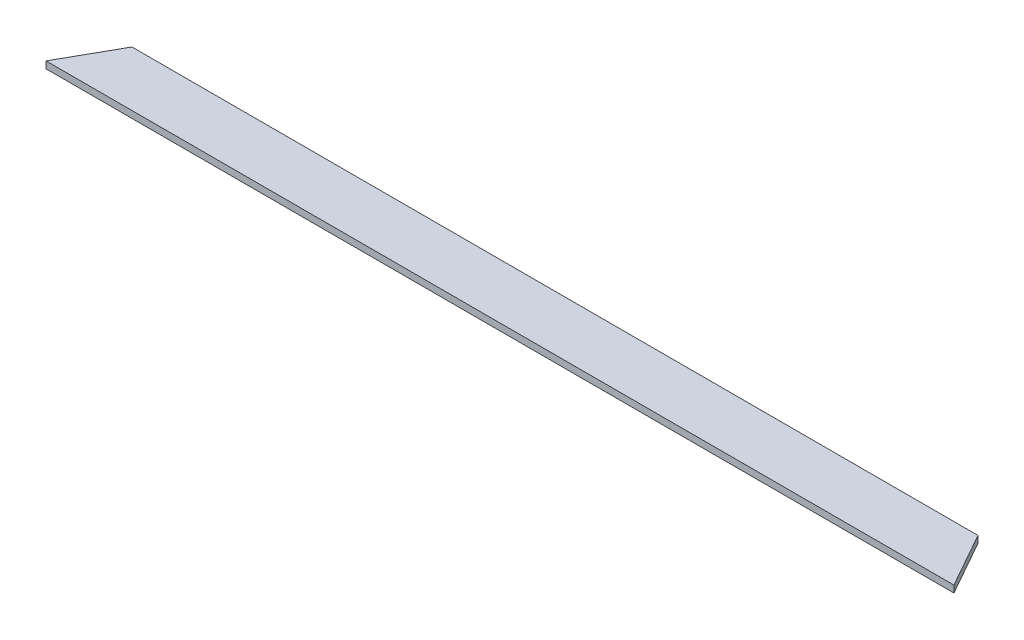
ISO-10303-21;
HEADER;
FILE_DESCRIPTION(('STEP AP214'),'2;1');
FILE_NAME('part.step','',(''),(''),'','','');
FILE_SCHEMA(('AUTOMOTIVE_DESIGN { 1 0 10303 214 1 1 1 1 }'));
ENDSEC;
DATA;
#1=APPLICATION_CONTEXT('core data for automotive mechanical design processes');
#2=APPLICATION_PROTOCOL_DEFINITION('international standard','automotive_design',2000,#1);
#3=PRODUCT_CONTEXT('',#1,'mechanical');
#4=PRODUCT('Part','Part','',(#3));
#5=PRODUCT_RELATED_PRODUCT_CATEGORY('part','',(#4));
#6=PRODUCT_DEFINITION_FORMATION('','',#4);
#7=PRODUCT_DEFINITION_CONTEXT('part definition',#1,'design');
#8=PRODUCT_DEFINITION('design','',#6,#7);
#9=PRODUCT_DEFINITION_SHAPE('','',#8);
#10=(LENGTH_UNIT() NAMED_UNIT(*) SI_UNIT(.MILLI.,.METRE.));
#11=(NAMED_UNIT(*) PLANE_ANGLE_UNIT() SI_UNIT($,.RADIAN.));
#12=(NAMED_UNIT(*) SI_UNIT($,.STERADIAN.) SOLID_ANGLE_UNIT());
#13=UNCERTAINTY_MEASURE_WITH_UNIT(LENGTH_MEASURE(1.E-05),#10,'distance_accuracy_value','');
#14=(GEOMETRIC_REPRESENTATION_CONTEXT(3) GLOBAL_UNCERTAINTY_ASSIGNED_CONTEXT((#13)) GLOBAL_UNIT_ASSIGNED_CONTEXT((#10,
#11,#12)) REPRESENTATION_CONTEXT('',''));
#15=CARTESIAN_POINT('',(0.,0.,0.));
#16=DIRECTION('',(0.,0.,1.));
#17=DIRECTION('',(1.,0.,0.));
#18=AXIS2_PLACEMENT_3D('',#15,#16,#17);
#19=CARTESIAN_POINT('',(-209.55,3.175,25.4000000000001));
#20=DIRECTION('',(0.87157553712455,0.,0.490261239632558));
#21=DIRECTION('',(0.490261239632558,0.,-0.87157553712455));
#22=AXIS2_PLACEMENT_3D('',#19,#20,#21);
#23=PLANE('',#22);
#24=DIRECTION('',(-0.490261239632558,0.,0.87157553712455));
#25=VECTOR('',#24,1.);
#26=CARTESIAN_POINT('',(-209.55,0.,25.4000000000001));
#27=LINE('',#26,#25);
#28=CARTESIAN_POINT('',(-195.2625,0.,0.));
#29=VERTEX_POINT('',#28);
#30=CARTESIAN_POINT('',(-209.55,0.,25.4000000000001));
#31=VERTEX_POINT('',#30);
#32=EDGE_CURVE('E86',#29,#31,#27,.T.);
#33=ORIENTED_EDGE('',*,*,#32,.T.);
#34=DIRECTION('',(0.,-1.,0.));
#35=VECTOR('',#34,1.);
#36=CARTESIAN_POINT('',(-209.55,3.175,25.4000000000001));
#37=LINE('',#36,#35);
#38=CARTESIAN_POINT('',(-209.55,3.175,25.4000000000001));
#39=VERTEX_POINT('',#38);
#40=EDGE_CURVE('E40',#39,#31,#37,.T.);
#41=ORIENTED_EDGE('',*,*,#40,.F.);
#42=DIRECTION('',(-0.490261239632558,0.,0.87157553712455));
#43=VECTOR('',#42,1.);
#44=CARTESIAN_POINT('',(-209.55,3.175,25.4000000000001));
#45=LINE('',#44,#43);
#46=CARTESIAN_POINT('',(-195.2625,3.175,0.));
#47=VERTEX_POINT('',#46);
#48=EDGE_CURVE('E79',#47,#39,#45,.T.);
#49=ORIENTED_EDGE('',*,*,#48,.F.);
#50=DIRECTION('',(0.,-1.,0.));
#51=VECTOR('',#50,1.);
#52=CARTESIAN_POINT('',(-195.2625,3.175,0.));
#53=LINE('',#52,#51);
#54=EDGE_CURVE('E11',#47,#29,#53,.T.);
#55=ORIENTED_EDGE('',*,*,#54,.T.);
#56=EDGE_LOOP('',(#33,#41,#49,#55));
#57=FACE_BOUND('',#56,.T.);
#58=ADVANCED_FACE('F32',(#57),#23,.F.);
#59=CARTESIAN_POINT('',(209.55,3.175,25.4000000000001));
#60=DIRECTION('',(0.,0.,-1.));
#61=DIRECTION('',(-1.,0.,0.));
#62=AXIS2_PLACEMENT_3D('',#59,#60,#61);
#63=PLANE('',#62);
#64=DIRECTION('',(1.,0.,0.));
#65=VECTOR('',#64,1.);
#66=CARTESIAN_POINT('',(209.55,0.,25.4000000000001));
#67=LINE('',#66,#65);
#68=CARTESIAN_POINT('',(209.55,0.,25.4000000000001));
#69=VERTEX_POINT('',#68);
#70=EDGE_CURVE('E66',#31,#69,#67,.T.);
#71=ORIENTED_EDGE('',*,*,#70,.T.);
#72=DIRECTION('',(0.,-1.,0.));
#73=VECTOR('',#72,1.);
#74=CARTESIAN_POINT('',(209.55,3.175,25.4000000000001));
#75=LINE('',#74,#73);
#76=CARTESIAN_POINT('',(209.55,3.175,25.4000000000001));
#77=VERTEX_POINT('',#76);
#78=EDGE_CURVE('E87',#77,#69,#75,.T.);
#79=ORIENTED_EDGE('',*,*,#78,.F.);
#80=DIRECTION('',(1.,0.,0.));
#81=VECTOR('',#80,1.);
#82=CARTESIAN_POINT('',(209.55,3.175,25.4000000000001));
#83=LINE('',#82,#81);
#84=EDGE_CURVE('E83',#39,#77,#83,.T.);
#85=ORIENTED_EDGE('',*,*,#84,.F.);
#86=ORIENTED_EDGE('',*,*,#40,.T.);
#87=EDGE_LOOP('',(#71,#79,#85,#86));
#88=FACE_BOUND('',#87,.T.);
#89=ADVANCED_FACE('F88',(#88),#63,.F.);
#90=CARTESIAN_POINT('',(195.2625,3.175,0.));
#91=DIRECTION('',(-0.87157553712455,0.,0.490261239632558));
#92=DIRECTION('',(0.490261239632558,0.,0.87157553712455));
#93=AXIS2_PLACEMENT_3D('',#90,#91,#92);
#94=PLANE('',#93);
#95=DIRECTION('',(-0.490261239632558,0.,-0.87157553712455));
#96=VECTOR('',#95,1.);
#97=CARTESIAN_POINT('',(195.2625,0.,0.));
#98=LINE('',#97,#96);
#99=CARTESIAN_POINT('',(195.2625,0.,0.));
#100=VERTEX_POINT('',#99);
#101=EDGE_CURVE('E73',#69,#100,#98,.T.);
#102=ORIENTED_EDGE('',*,*,#101,.T.);
#103=DIRECTION('',(0.,-1.,0.));
#104=VECTOR('',#103,1.);
#105=CARTESIAN_POINT('',(195.2625,3.175,0.));
#106=LINE('',#105,#104);
#107=CARTESIAN_POINT('',(195.2625,3.175,0.));
#108=VERTEX_POINT('',#107);
#109=EDGE_CURVE('E92',#108,#100,#106,.T.);
#110=ORIENTED_EDGE('',*,*,#109,.F.);
#111=DIRECTION('',(-0.490261239632558,0.,-0.87157553712455));
#112=VECTOR('',#111,1.);
#113=CARTESIAN_POINT('',(195.2625,3.175,0.));
#114=LINE('',#113,#112);
#115=EDGE_CURVE('E90',#77,#108,#114,.T.);
#116=ORIENTED_EDGE('',*,*,#115,.F.);
#117=ORIENTED_EDGE('',*,*,#78,.T.);
#118=EDGE_LOOP('',(#102,#110,#116,#117));
#119=FACE_BOUND('',#118,.T.);
#120=ADVANCED_FACE('F102',(#119),#94,.F.);
#121=CARTESIAN_POINT('',(0.,3.175,0.));
#122=DIRECTION('',(0.,0.,1.));
#123=DIRECTION('',(1.,0.,0.));
#124=AXIS2_PLACEMENT_3D('',#121,#122,#123);
#125=PLANE('',#124);
#126=DIRECTION('',(-1.,0.,0.));
#127=VECTOR('',#126,1.);
#128=CARTESIAN_POINT('',(0.,0.,0.));
#129=LINE('',#128,#127);
#130=EDGE_CURVE('E99',#100,#29,#129,.T.);
#131=ORIENTED_EDGE('',*,*,#130,.T.);
#132=ORIENTED_EDGE('',*,*,#54,.F.);
#133=DIRECTION('',(-1.,0.,0.));
#134=VECTOR('',#133,1.);
#135=CARTESIAN_POINT('',(-195.2625,3.175,0.));
#136=LINE('',#135,#134);
#137=EDGE_CURVE('E48',#108,#47,#136,.T.);
#138=ORIENTED_EDGE('',*,*,#137,.F.);
#139=ORIENTED_EDGE('',*,*,#109,.T.);
#140=EDGE_LOOP('',(#131,#132,#138,#139));
#141=FACE_BOUND('',#140,.T.);
#142=ADVANCED_FACE('F106',(#141),#125,.F.);
#143=CARTESIAN_POINT('',(0.,3.175,0.));
#144=DIRECTION('',(0.,-1.,0.));
#145=DIRECTION('',(0.,0.,-1.));
#146=AXIS2_PLACEMENT_3D('',#143,#144,#145);
#147=PLANE('',#146);
#148=ORIENTED_EDGE('',*,*,#137,.T.);
#149=ORIENTED_EDGE('',*,*,#48,.T.);
#150=ORIENTED_EDGE('',*,*,#84,.T.);
#151=ORIENTED_EDGE('',*,*,#115,.T.);
#152=EDGE_LOOP('',(#148,#149,#150,#151));
#153=FACE_BOUND('',#152,.T.);
#154=ADVANCED_FACE('F81',(#153),#147,.F.);
#155=CARTESIAN_POINT('',(0.,0.,0.));
#156=DIRECTION('',(0.,-1.,0.));
#157=DIRECTION('',(0.,0.,-1.));
#158=AXIS2_PLACEMENT_3D('',#155,#156,#157);
#159=PLANE('',#158);
#160=ORIENTED_EDGE('',*,*,#32,.F.);
#161=ORIENTED_EDGE('',*,*,#130,.F.);
#162=ORIENTED_EDGE('',*,*,#101,.F.);
#163=ORIENTED_EDGE('',*,*,#70,.F.);
#164=EDGE_LOOP('',(#160,#161,#162,#163));
#165=FACE_BOUND('',#164,.T.);
#166=ADVANCED_FACE('F105',(#165),#159,.T.);
#167=CLOSED_SHELL('',(#58,#89,#120,#142,#154,#166));
#168=MANIFOLD_SOLID_BREP('B2',#167);
#169=ADVANCED_BREP_SHAPE_REPRESENTATION('',(#18,#168),#14);
#170=SHAPE_DEFINITION_REPRESENTATION(#9,#169);
ENDSEC;
END-ISO-10303-21;
